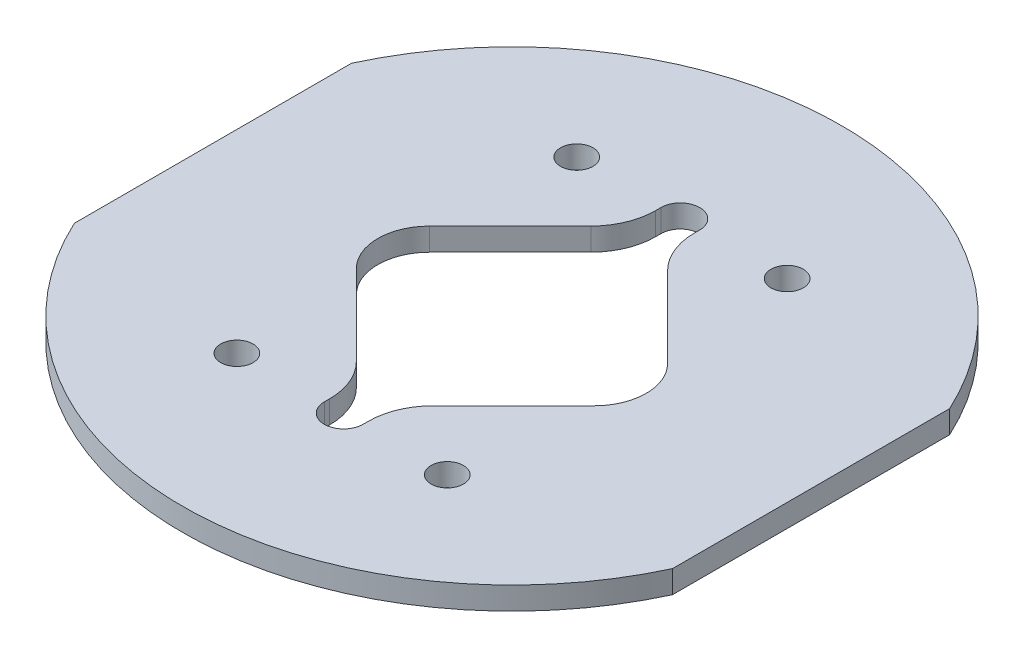
ISO-10303-21;
HEADER;
FILE_DESCRIPTION(('STEP AP214'),'2;1');
FILE_NAME('part.step','',(''),(''),'','','');
FILE_SCHEMA(('AUTOMOTIVE_DESIGN { 1 0 10303 214 1 1 1 1 }'));
ENDSEC;
DATA;
#1=APPLICATION_CONTEXT('core data for automotive mechanical design processes');
#2=APPLICATION_PROTOCOL_DEFINITION('international standard','automotive_design',2000,#1);
#3=PRODUCT_CONTEXT('',#1,'mechanical');
#4=PRODUCT('Part','Part','',(#3));
#5=PRODUCT_RELATED_PRODUCT_CATEGORY('part','',(#4));
#6=PRODUCT_DEFINITION_FORMATION('','',#4);
#7=PRODUCT_DEFINITION_CONTEXT('part definition',#1,'design');
#8=PRODUCT_DEFINITION('design','',#6,#7);
#9=PRODUCT_DEFINITION_SHAPE('','',#8);
#10=(LENGTH_UNIT() NAMED_UNIT(*) SI_UNIT(.MILLI.,.METRE.));
#11=(NAMED_UNIT(*) PLANE_ANGLE_UNIT() SI_UNIT($,.RADIAN.));
#12=(NAMED_UNIT(*) SI_UNIT($,.STERADIAN.) SOLID_ANGLE_UNIT());
#13=UNCERTAINTY_MEASURE_WITH_UNIT(LENGTH_MEASURE(1.E-05),#10,'distance_accuracy_value','');
#14=(GEOMETRIC_REPRESENTATION_CONTEXT(3) GLOBAL_UNCERTAINTY_ASSIGNED_CONTEXT((#13)) GLOBAL_UNIT_ASSIGNED_CONTEXT((#10,
#11,#12)) REPRESENTATION_CONTEXT('',''));
#15=CARTESIAN_POINT('',(0.,0.,0.));
#16=DIRECTION('',(0.,0.,1.));
#17=DIRECTION('',(1.,0.,0.));
#18=AXIS2_PLACEMENT_3D('',#15,#16,#17);
#19=CARTESIAN_POINT('',(0.,1.75,0.));
#20=DIRECTION('',(0.,-1.,0.));
#21=DIRECTION('',(0.,0.,-1.));
#22=AXIS2_PLACEMENT_3D('',#19,#20,#21);
#23=CYLINDRICAL_SURFACE('',#22,25.46);
#24=CARTESIAN_POINT('',(0.,0.,0.));
#25=DIRECTION('',(0.,1.,0.));
#26=DIRECTION('',(0.,0.,-1.));
#27=AXIS2_PLACEMENT_3D('',#24,#25,#26);
#28=CIRCLE('',#27,25.46);
#29=CARTESIAN_POINT('',(-23.1,0.,10.7052136830612));
#30=VERTEX_POINT('',#29);
#31=CARTESIAN_POINT('',(23.1,0.,10.7052136830612));
#32=VERTEX_POINT('',#31);
#33=EDGE_CURVE('E238',#30,#32,#28,.T.);
#34=ORIENTED_EDGE('',*,*,#33,.T.);
#35=DIRECTION('',(0.,-1.,0.));
#36=VECTOR('',#35,1.);
#37=CARTESIAN_POINT('',(23.1,1.75,10.7052136830612));
#38=LINE('',#37,#36);
#39=CARTESIAN_POINT('',(23.1,1.75,10.7052136830612));
#40=VERTEX_POINT('',#39);
#41=EDGE_CURVE('E272',#40,#32,#38,.T.);
#42=ORIENTED_EDGE('',*,*,#41,.F.);
#43=CARTESIAN_POINT('',(0.,1.75,0.));
#44=DIRECTION('',(0.,1.,0.));
#45=DIRECTION('',(0.,0.,-1.));
#46=AXIS2_PLACEMENT_3D('',#43,#44,#45);
#47=CIRCLE('',#46,25.46);
#48=CARTESIAN_POINT('',(-23.1,1.75,10.7052136830612));
#49=VERTEX_POINT('',#48);
#50=EDGE_CURVE('E246',#49,#40,#47,.T.);
#51=ORIENTED_EDGE('',*,*,#50,.F.);
#52=DIRECTION('',(0.,-1.,0.));
#53=VECTOR('',#52,1.);
#54=CARTESIAN_POINT('',(-23.1,1.75,10.7052136830612));
#55=LINE('',#54,#53);
#56=EDGE_CURVE('E256',#49,#30,#55,.T.);
#57=ORIENTED_EDGE('',*,*,#56,.T.);
#58=EDGE_LOOP('',(#34,#42,#51,#57));
#59=FACE_BOUND('',#58,.T.);
#60=ADVANCED_FACE('F34',(#59),#23,.T.);
#61=CARTESIAN_POINT('',(23.1,1.75,-10.7052136830612));
#62=DIRECTION('',(-1.,0.,0.));
#63=DIRECTION('',(0.,0.,1.));
#64=AXIS2_PLACEMENT_3D('',#61,#62,#63);
#65=PLANE('',#64);
#66=DIRECTION('',(0.,0.,-1.));
#67=VECTOR('',#66,1.);
#68=CARTESIAN_POINT('',(23.1,0.,-10.7052136830612));
#69=LINE('',#68,#67);
#70=CARTESIAN_POINT('',(23.1,0.,-10.7052136830612));
#71=VERTEX_POINT('',#70);
#72=EDGE_CURVE('E259',#32,#71,#69,.T.);
#73=ORIENTED_EDGE('',*,*,#72,.T.);
#74=DIRECTION('',(0.,-1.,0.));
#75=VECTOR('',#74,1.);
#76=CARTESIAN_POINT('',(23.1,1.75,-10.7052136830612));
#77=LINE('',#76,#75);
#78=CARTESIAN_POINT('',(23.1,1.75,-10.7052136830612));
#79=VERTEX_POINT('',#78);
#80=EDGE_CURVE('E269',#79,#71,#77,.T.);
#81=ORIENTED_EDGE('',*,*,#80,.F.);
#82=DIRECTION('',(0.,0.,-1.));
#83=VECTOR('',#82,1.);
#84=CARTESIAN_POINT('',(23.1,1.75,-10.7052136830612));
#85=LINE('',#84,#83);
#86=EDGE_CURVE('E249',#40,#79,#85,.T.);
#87=ORIENTED_EDGE('',*,*,#86,.F.);
#88=ORIENTED_EDGE('',*,*,#41,.T.);
#89=EDGE_LOOP('',(#73,#81,#87,#88));
#90=FACE_BOUND('',#89,.T.);
#91=ADVANCED_FACE('F393',(#90),#65,.F.);
#92=CARTESIAN_POINT('',(0.,1.75,0.));
#93=DIRECTION('',(0.,-1.,0.));
#94=DIRECTION('',(0.,0.,-1.));
#95=AXIS2_PLACEMENT_3D('',#92,#93,#94);
#96=CYLINDRICAL_SURFACE('',#95,25.46);
#97=CARTESIAN_POINT('',(0.,0.,0.));
#98=DIRECTION('',(0.,1.,0.));
#99=DIRECTION('',(0.,0.,-1.));
#100=AXIS2_PLACEMENT_3D('',#97,#98,#99);
#101=CIRCLE('',#100,25.46);
#102=CARTESIAN_POINT('',(-23.1,0.,-10.7052136830612));
#103=VERTEX_POINT('',#102);
#104=EDGE_CURVE('E261',#71,#103,#101,.T.);
#105=ORIENTED_EDGE('',*,*,#104,.T.);
#106=DIRECTION('',(0.,-1.,0.));
#107=VECTOR('',#106,1.);
#108=CARTESIAN_POINT('',(-23.1,1.75,-10.7052136830612));
#109=LINE('',#108,#107);
#110=CARTESIAN_POINT('',(-23.1,1.75,-10.7052136830612));
#111=VERTEX_POINT('',#110);
#112=EDGE_CURVE('E266',#111,#103,#109,.T.);
#113=ORIENTED_EDGE('',*,*,#112,.F.);
#114=CARTESIAN_POINT('',(0.,1.75,0.));
#115=DIRECTION('',(0.,1.,0.));
#116=DIRECTION('',(0.,0.,-1.));
#117=AXIS2_PLACEMENT_3D('',#114,#115,#116);
#118=CIRCLE('',#117,25.46);
#119=EDGE_CURVE('E252',#79,#111,#118,.T.);
#120=ORIENTED_EDGE('',*,*,#119,.F.);
#121=ORIENTED_EDGE('',*,*,#80,.T.);
#122=EDGE_LOOP('',(#105,#113,#120,#121));
#123=FACE_BOUND('',#122,.T.);
#124=ADVANCED_FACE('F399',(#123),#96,.T.);
#125=CARTESIAN_POINT('',(-23.1,1.75,10.7052136830612));
#126=DIRECTION('',(1.,0.,0.));
#127=DIRECTION('',(0.,0.,-1.));
#128=AXIS2_PLACEMENT_3D('',#125,#126,#127);
#129=PLANE('',#128);
#130=DIRECTION('',(0.,0.,1.));
#131=VECTOR('',#130,1.);
#132=CARTESIAN_POINT('',(-23.1,0.,10.7052136830612));
#133=LINE('',#132,#131);
#134=EDGE_CURVE('E250',#103,#30,#133,.T.);
#135=ORIENTED_EDGE('',*,*,#134,.T.);
#136=ORIENTED_EDGE('',*,*,#56,.F.);
#137=DIRECTION('',(0.,0.,1.));
#138=VECTOR('',#137,1.);
#139=CARTESIAN_POINT('',(-23.1,1.75,10.7052136830612));
#140=LINE('',#139,#138);
#141=EDGE_CURVE('E254',#111,#49,#140,.T.);
#142=ORIENTED_EDGE('',*,*,#141,.F.);
#143=ORIENTED_EDGE('',*,*,#112,.T.);
#144=EDGE_LOOP('',(#135,#136,#142,#143));
#145=FACE_BOUND('',#144,.T.);
#146=ADVANCED_FACE('F466',(#145),#129,.F.);
#147=CARTESIAN_POINT('',(0.,1.75,0.));
#148=DIRECTION('',(0.,-1.,0.));
#149=DIRECTION('',(0.,0.,-1.));
#150=AXIS2_PLACEMENT_3D('',#147,#148,#149);
#151=PLANE('',#150);
#152=CARTESIAN_POINT('',(8.125,1.75,13.125));
#153=DIRECTION('',(0.,1.,0.));
#154=DIRECTION('',(0.,0.,-1.));
#155=AXIS2_PLACEMENT_3D('',#152,#153,#154);
#156=CIRCLE('',#155,1.25);
#157=CARTESIAN_POINT('',(8.125,1.75,11.875));
#158=VERTEX_POINT('',#157);
#159=EDGE_CURVE('E444',#158,#158,#156,.T.);
#160=ORIENTED_EDGE('',*,*,#159,.F.);
#161=EDGE_LOOP('',(#160));
#162=FACE_BOUND('',#161,.T.);
#163=CARTESIAN_POINT('',(-8.125,1.75,13.125));
#164=DIRECTION('',(0.,1.,0.));
#165=DIRECTION('',(0.,0.,-1.));
#166=AXIS2_PLACEMENT_3D('',#163,#164,#165);
#167=CIRCLE('',#166,1.25);
#168=CARTESIAN_POINT('',(-8.125,1.75,11.875));
#169=VERTEX_POINT('',#168);
#170=EDGE_CURVE('E450',#169,#169,#167,.T.);
#171=ORIENTED_EDGE('',*,*,#170,.F.);
#172=EDGE_LOOP('',(#171));
#173=FACE_BOUND('',#172,.T.);
#174=CARTESIAN_POINT('',(-8.125,1.75,-13.125));
#175=DIRECTION('',(0.,1.,0.));
#176=DIRECTION('',(0.,0.,1.));
#177=AXIS2_PLACEMENT_3D('',#174,#175,#176);
#178=CIRCLE('',#177,1.25);
#179=CARTESIAN_POINT('',(-8.125,1.75,-11.875));
#180=VERTEX_POINT('',#179);
#181=EDGE_CURVE('E457',#180,#180,#178,.T.);
#182=ORIENTED_EDGE('',*,*,#181,.F.);
#183=EDGE_LOOP('',(#182));
#184=FACE_BOUND('',#183,.T.);
#185=CARTESIAN_POINT('',(8.125,1.75,-13.125));
#186=DIRECTION('',(0.,1.,0.));
#187=DIRECTION('',(0.,0.,1.));
#188=AXIS2_PLACEMENT_3D('',#185,#186,#187);
#189=CIRCLE('',#188,1.25);
#190=CARTESIAN_POINT('',(8.125,1.75,-11.875));
#191=VERTEX_POINT('',#190);
#192=EDGE_CURVE('E206',#191,#191,#189,.T.);
#193=ORIENTED_EDGE('',*,*,#192,.F.);
#194=EDGE_LOOP('',(#193));
#195=FACE_BOUND('',#194,.T.);
#196=DIRECTION('',(0.,0.,1.));
#197=VECTOR('',#196,1.);
#198=CARTESIAN_POINT('',(-1.5,1.75,-13.));
#199=LINE('',#198,#197);
#200=CARTESIAN_POINT('',(-1.49999999999998,1.75,12.5918830920368));
#201=VERTEX_POINT('',#200);
#202=CARTESIAN_POINT('',(-1.49999999999998,1.75,13.));
#203=VERTEX_POINT('',#202);
#204=EDGE_CURVE('E214',#201,#203,#199,.T.);
#205=ORIENTED_EDGE('',*,*,#204,.F.);
#206=CARTESIAN_POINT('',(-6.49999999999998,1.75,12.5918830920368));
#207=DIRECTION('',(0.,-1.,0.));
#208=DIRECTION('',(0.,0.,-1.));
#209=AXIS2_PLACEMENT_3D('',#206,#207,#208);
#210=CIRCLE('',#209,5.);
#211=CARTESIAN_POINT('',(-2.96446609406724,1.75,9.05634918610406));
#212=VERTEX_POINT('',#211);
#213=EDGE_CURVE('E295',#201,#212,#210,.F.);
#214=ORIENTED_EDGE('',*,*,#213,.T.);
#215=DIRECTION('',(0.707106781186548,0.,0.707106781186547));
#216=VECTOR('',#215,1.);
#217=CARTESIAN_POINT('',(0.,1.75,12.0208152801713));
#218=LINE('',#217,#216);
#219=CARTESIAN_POINT('',(-9.19238815542512,1.75,2.82842712474619));
#220=VERTEX_POINT('',#219);
#221=EDGE_CURVE('E232',#220,#212,#218,.T.);
#222=ORIENTED_EDGE('',*,*,#221,.F.);
#223=CARTESIAN_POINT('',(-6.36396103067893,1.75,0.));
#224=DIRECTION('',(0.,-1.,0.));
#225=DIRECTION('',(0.,0.,-1.));
#226=AXIS2_PLACEMENT_3D('',#223,#224,#225);
#227=CIRCLE('',#226,4.);
#228=CARTESIAN_POINT('',(-9.19238815542512,1.75,-2.82842712474619));
#229=VERTEX_POINT('',#228);
#230=EDGE_CURVE('E42',#220,#229,#227,.T.);
#231=ORIENTED_EDGE('',*,*,#230,.T.);
#232=DIRECTION('',(-0.707106781186548,0.,0.707106781186548));
#233=VECTOR('',#232,1.);
#234=CARTESIAN_POINT('',(-12.0208152801713,1.75,0.));
#235=LINE('',#234,#233);
#236=CARTESIAN_POINT('',(-2.96446609406725,1.75,-9.05634918610406));
#237=VERTEX_POINT('',#236);
#238=EDGE_CURVE('E243',#237,#229,#235,.T.);
#239=ORIENTED_EDGE('',*,*,#238,.F.);
#240=CARTESIAN_POINT('',(-6.5,1.75,-12.5918830920368));
#241=DIRECTION('',(0.,-1.,0.));
#242=DIRECTION('',(0.,0.,-1.));
#243=AXIS2_PLACEMENT_3D('',#240,#241,#242);
#244=CIRCLE('',#243,5.);
#245=CARTESIAN_POINT('',(-1.5,1.75,-12.5918830920368));
#246=VERTEX_POINT('',#245);
#247=EDGE_CURVE('E288',#237,#246,#244,.F.);
#248=ORIENTED_EDGE('',*,*,#247,.T.);
#249=CARTESIAN_POINT('',(-1.5,1.75,-13.));
#250=VERTEX_POINT('',#249);
#251=EDGE_CURVE('E216',#250,#246,#199,.T.);
#252=ORIENTED_EDGE('',*,*,#251,.F.);
#253=CARTESIAN_POINT('',(0.,1.75,-13.));
#254=DIRECTION('',(0.,1.,0.));
#255=DIRECTION('',(0.,0.,1.));
#256=AXIS2_PLACEMENT_3D('',#253,#254,#255);
#257=CIRCLE('',#256,1.5);
#258=CARTESIAN_POINT('',(1.5,1.75,-13.));
#259=VERTEX_POINT('',#258);
#260=EDGE_CURVE('E178',#259,#250,#257,.T.);
#261=ORIENTED_EDGE('',*,*,#260,.F.);
#262=DIRECTION('',(0.,0.,-1.));
#263=VECTOR('',#262,1.);
#264=CARTESIAN_POINT('',(1.5,1.75,13.));
#265=LINE('',#264,#263);
#266=CARTESIAN_POINT('',(1.5,1.75,-12.5918830920368));
#267=VERTEX_POINT('',#266);
#268=EDGE_CURVE('E203',#267,#259,#265,.T.);
#269=ORIENTED_EDGE('',*,*,#268,.F.);
#270=CARTESIAN_POINT('',(6.5,1.75,-12.5918830920368));
#271=DIRECTION('',(0.,-1.,0.));
#272=DIRECTION('',(0.,0.,-1.));
#273=AXIS2_PLACEMENT_3D('',#270,#271,#272);
#274=CIRCLE('',#273,5.);
#275=CARTESIAN_POINT('',(2.96446609406726,1.75,-9.05634918610405));
#276=VERTEX_POINT('',#275);
#277=EDGE_CURVE('E290',#267,#276,#274,.F.);
#278=ORIENTED_EDGE('',*,*,#277,.T.);
#279=DIRECTION('',(-0.707106781186548,0.,-0.707106781186548));
#280=VECTOR('',#279,1.);
#281=CARTESIAN_POINT('',(12.0208152801713,1.75,0.));
#282=LINE('',#281,#280);
#283=CARTESIAN_POINT('',(9.19238815542512,1.75,-2.82842712474619));
#284=VERTEX_POINT('',#283);
#285=EDGE_CURVE('E241',#284,#276,#282,.T.);
#286=ORIENTED_EDGE('',*,*,#285,.F.);
#287=CARTESIAN_POINT('',(6.36396103067893,1.75,0.));
#288=DIRECTION('',(0.,-1.,0.));
#289=DIRECTION('',(0.,0.,-1.));
#290=AXIS2_PLACEMENT_3D('',#287,#288,#289);
#291=CIRCLE('',#290,4.);
#292=CARTESIAN_POINT('',(9.19238815542512,1.75,2.82842712474619));
#293=VERTEX_POINT('',#292);
#294=EDGE_CURVE('E321',#284,#293,#291,.T.);
#295=ORIENTED_EDGE('',*,*,#294,.T.);
#296=DIRECTION('',(0.707106781186548,0.,-0.707106781186547));
#297=VECTOR('',#296,1.);
#298=CARTESIAN_POINT('',(0.,1.75,12.0208152801713));
#299=LINE('',#298,#297);
#300=CARTESIAN_POINT('',(2.96446609406726,1.75,9.05634918610405));
#301=VERTEX_POINT('',#300);
#302=EDGE_CURVE('E223',#301,#293,#299,.T.);
#303=ORIENTED_EDGE('',*,*,#302,.F.);
#304=CARTESIAN_POINT('',(6.5,1.75,12.5918830920368));
#305=DIRECTION('',(0.,-1.,0.));
#306=DIRECTION('',(0.,0.,-1.));
#307=AXIS2_PLACEMENT_3D('',#304,#305,#306);
#308=CIRCLE('',#307,5.);
#309=CARTESIAN_POINT('',(1.5,1.75,12.5918830920368));
#310=VERTEX_POINT('',#309);
#311=EDGE_CURVE('E293',#301,#310,#308,.F.);
#312=ORIENTED_EDGE('',*,*,#311,.T.);
#313=CARTESIAN_POINT('',(1.5,1.75,13.));
#314=VERTEX_POINT('',#313);
#315=EDGE_CURVE('E200',#314,#310,#265,.T.);
#316=ORIENTED_EDGE('',*,*,#315,.F.);
#317=CARTESIAN_POINT('',(0.,1.75,13.));
#318=DIRECTION('',(0.,1.,0.));
#319=DIRECTION('',(0.,0.,-1.));
#320=AXIS2_PLACEMENT_3D('',#317,#318,#319);
#321=CIRCLE('',#320,1.49999999999999);
#322=EDGE_CURVE('E218',#203,#314,#321,.T.);
#323=ORIENTED_EDGE('',*,*,#322,.F.);
#324=EDGE_LOOP('',(#205,#214,#222,#231,#239,#248,#252,#261,#269,#278,#286,#295,#303,#312,#316,#323));
#325=FACE_BOUND('',#324,.T.);
#326=ORIENTED_EDGE('',*,*,#50,.T.);
#327=ORIENTED_EDGE('',*,*,#86,.T.);
#328=ORIENTED_EDGE('',*,*,#119,.T.);
#329=ORIENTED_EDGE('',*,*,#141,.T.);
#330=EDGE_LOOP('',(#326,#327,#328,#329));
#331=FACE_BOUND('',#330,.T.);
#332=ADVANCED_FACE('F338',(#162,#173,#184,#195,#325,#331),#151,.F.);
#333=CARTESIAN_POINT('',(0.,0.,0.));
#334=DIRECTION('',(0.,-1.,0.));
#335=DIRECTION('',(0.,0.,-1.));
#336=AXIS2_PLACEMENT_3D('',#333,#334,#335);
#337=PLANE('',#336);
#338=CARTESIAN_POINT('',(8.125,0.,13.125));
#339=DIRECTION('',(0.,1.,0.));
#340=DIRECTION('',(0.,0.,-1.));
#341=AXIS2_PLACEMENT_3D('',#338,#339,#340);
#342=CIRCLE('',#341,1.25);
#343=CARTESIAN_POINT('',(8.125,0.,11.875));
#344=VERTEX_POINT('',#343);
#345=EDGE_CURVE('E441',#344,#344,#342,.T.);
#346=ORIENTED_EDGE('',*,*,#345,.T.);
#347=EDGE_LOOP('',(#346));
#348=FACE_BOUND('',#347,.T.);
#349=CARTESIAN_POINT('',(-8.125,0.,13.125));
#350=DIRECTION('',(0.,1.,0.));
#351=DIRECTION('',(0.,0.,-1.));
#352=AXIS2_PLACEMENT_3D('',#349,#350,#351);
#353=CIRCLE('',#352,1.25);
#354=CARTESIAN_POINT('',(-8.125,0.,11.875));
#355=VERTEX_POINT('',#354);
#356=EDGE_CURVE('E446',#355,#355,#353,.T.);
#357=ORIENTED_EDGE('',*,*,#356,.T.);
#358=EDGE_LOOP('',(#357));
#359=FACE_BOUND('',#358,.T.);
#360=CARTESIAN_POINT('',(-8.125,0.,-13.125));
#361=DIRECTION('',(0.,1.,0.));
#362=DIRECTION('',(0.,0.,1.));
#363=AXIS2_PLACEMENT_3D('',#360,#361,#362);
#364=CIRCLE('',#363,1.25);
#365=CARTESIAN_POINT('',(-8.125,0.,-11.875));
#366=VERTEX_POINT('',#365);
#367=EDGE_CURVE('E215',#366,#366,#364,.T.);
#368=ORIENTED_EDGE('',*,*,#367,.T.);
#369=EDGE_LOOP('',(#368));
#370=FACE_BOUND('',#369,.T.);
#371=CARTESIAN_POINT('',(8.125,0.,-13.125));
#372=DIRECTION('',(0.,1.,0.));
#373=DIRECTION('',(0.,0.,1.));
#374=AXIS2_PLACEMENT_3D('',#371,#372,#373);
#375=CIRCLE('',#374,1.25);
#376=CARTESIAN_POINT('',(8.125,0.,-11.875));
#377=VERTEX_POINT('',#376);
#378=EDGE_CURVE('E459',#377,#377,#375,.T.);
#379=ORIENTED_EDGE('',*,*,#378,.T.);
#380=EDGE_LOOP('',(#379));
#381=FACE_BOUND('',#380,.T.);
#382=DIRECTION('',(-0.707106781186548,0.,0.707106781186548));
#383=VECTOR('',#382,1.);
#384=CARTESIAN_POINT('',(-12.0208152801713,0.,0.));
#385=LINE('',#384,#383);
#386=CARTESIAN_POINT('',(-2.96446609406725,0.,-9.05634918610406));
#387=VERTEX_POINT('',#386);
#388=CARTESIAN_POINT('',(-9.19238815542512,0.,-2.82842712474619));
#389=VERTEX_POINT('',#388);
#390=EDGE_CURVE('E234',#387,#389,#385,.T.);
#391=ORIENTED_EDGE('',*,*,#390,.T.);
#392=CARTESIAN_POINT('',(-6.36396103067893,0.,0.));
#393=DIRECTION('',(0.,-1.,0.));
#394=DIRECTION('',(0.,0.,-1.));
#395=AXIS2_PLACEMENT_3D('',#392,#393,#394);
#396=CIRCLE('',#395,4.);
#397=CARTESIAN_POINT('',(-9.19238815542512,0.,2.82842712474619));
#398=VERTEX_POINT('',#397);
#399=EDGE_CURVE('E11',#389,#398,#396,.F.);
#400=ORIENTED_EDGE('',*,*,#399,.T.);
#401=DIRECTION('',(0.707106781186548,0.,0.707106781186547));
#402=VECTOR('',#401,1.);
#403=CARTESIAN_POINT('',(0.,0.,12.0208152801713));
#404=LINE('',#403,#402);
#405=CARTESIAN_POINT('',(-2.96446609406724,0.,9.05634918610406));
#406=VERTEX_POINT('',#405);
#407=EDGE_CURVE('E236',#398,#406,#404,.T.);
#408=ORIENTED_EDGE('',*,*,#407,.T.);
#409=CARTESIAN_POINT('',(-6.49999999999998,0.,12.5918830920368));
#410=DIRECTION('',(0.,-1.,0.));
#411=DIRECTION('',(0.,0.,-1.));
#412=AXIS2_PLACEMENT_3D('',#409,#410,#411);
#413=CIRCLE('',#412,5.);
#414=CARTESIAN_POINT('',(-1.49999999999998,0.,12.5918830920368));
#415=VERTEX_POINT('',#414);
#416=EDGE_CURVE('E284',#406,#415,#413,.T.);
#417=ORIENTED_EDGE('',*,*,#416,.T.);
#418=DIRECTION('',(0.,0.,1.));
#419=VECTOR('',#418,1.);
#420=CARTESIAN_POINT('',(-1.5,0.,-13.));
#421=LINE('',#420,#419);
#422=CARTESIAN_POINT('',(-1.49999999999998,0.,13.));
#423=VERTEX_POINT('',#422);
#424=EDGE_CURVE('E193',#415,#423,#421,.T.);
#425=ORIENTED_EDGE('',*,*,#424,.T.);
#426=CARTESIAN_POINT('',(0.,0.,13.));
#427=DIRECTION('',(0.,1.,0.));
#428=DIRECTION('',(0.,0.,-1.));
#429=AXIS2_PLACEMENT_3D('',#426,#427,#428);
#430=CIRCLE('',#429,1.49999999999999);
#431=CARTESIAN_POINT('',(1.5,0.,13.));
#432=VERTEX_POINT('',#431);
#433=EDGE_CURVE('E192',#423,#432,#430,.T.);
#434=ORIENTED_EDGE('',*,*,#433,.T.);
#435=DIRECTION('',(0.,0.,-1.));
#436=VECTOR('',#435,1.);
#437=CARTESIAN_POINT('',(1.5,0.,13.));
#438=LINE('',#437,#436);
#439=CARTESIAN_POINT('',(1.5,0.,12.5918830920368));
#440=VERTEX_POINT('',#439);
#441=EDGE_CURVE('E183',#432,#440,#438,.T.);
#442=ORIENTED_EDGE('',*,*,#441,.T.);
#443=CARTESIAN_POINT('',(6.5,0.,12.5918830920368));
#444=DIRECTION('',(0.,-1.,0.));
#445=DIRECTION('',(0.,0.,-1.));
#446=AXIS2_PLACEMENT_3D('',#443,#444,#445);
#447=CIRCLE('',#446,5.);
#448=CARTESIAN_POINT('',(2.96446609406726,0.,9.05634918610405));
#449=VERTEX_POINT('',#448);
#450=EDGE_CURVE('E282',#440,#449,#447,.T.);
#451=ORIENTED_EDGE('',*,*,#450,.T.);
#452=DIRECTION('',(0.707106781186548,0.,-0.707106781186547));
#453=VECTOR('',#452,1.);
#454=CARTESIAN_POINT('',(0.,0.,12.0208152801713));
#455=LINE('',#454,#453);
#456=CARTESIAN_POINT('',(9.19238815542512,0.,2.82842712474619));
#457=VERTEX_POINT('',#456);
#458=EDGE_CURVE('E228',#449,#457,#455,.T.);
#459=ORIENTED_EDGE('',*,*,#458,.T.);
#460=CARTESIAN_POINT('',(6.36396103067893,0.,0.));
#461=DIRECTION('',(0.,-1.,0.));
#462=DIRECTION('',(0.,0.,-1.));
#463=AXIS2_PLACEMENT_3D('',#460,#461,#462);
#464=CIRCLE('',#463,4.);
#465=CARTESIAN_POINT('',(9.19238815542512,0.,-2.82842712474619));
#466=VERTEX_POINT('',#465);
#467=EDGE_CURVE('E323',#457,#466,#464,.F.);
#468=ORIENTED_EDGE('',*,*,#467,.T.);
#469=DIRECTION('',(-0.707106781186548,0.,-0.707106781186548));
#470=VECTOR('',#469,1.);
#471=CARTESIAN_POINT('',(12.0208152801713,0.,0.));
#472=LINE('',#471,#470);
#473=CARTESIAN_POINT('',(2.96446609406726,0.,-9.05634918610405));
#474=VERTEX_POINT('',#473);
#475=EDGE_CURVE('E231',#466,#474,#472,.T.);
#476=ORIENTED_EDGE('',*,*,#475,.T.);
#477=CARTESIAN_POINT('',(6.5,0.,-12.5918830920368));
#478=DIRECTION('',(0.,-1.,0.));
#479=DIRECTION('',(0.,0.,-1.));
#480=AXIS2_PLACEMENT_3D('',#477,#478,#479);
#481=CIRCLE('',#480,5.);
#482=CARTESIAN_POINT('',(1.5,0.,-12.5918830920368));
#483=VERTEX_POINT('',#482);
#484=EDGE_CURVE('E280',#474,#483,#481,.T.);
#485=ORIENTED_EDGE('',*,*,#484,.T.);
#486=CARTESIAN_POINT('',(1.5,0.,-13.));
#487=VERTEX_POINT('',#486);
#488=EDGE_CURVE('E198',#483,#487,#438,.T.);
#489=ORIENTED_EDGE('',*,*,#488,.T.);
#490=CARTESIAN_POINT('',(0.,0.,-13.));
#491=DIRECTION('',(0.,1.,0.));
#492=DIRECTION('',(0.,0.,1.));
#493=AXIS2_PLACEMENT_3D('',#490,#491,#492);
#494=CIRCLE('',#493,1.5);
#495=CARTESIAN_POINT('',(-1.5,0.,-13.));
#496=VERTEX_POINT('',#495);
#497=EDGE_CURVE('E176',#487,#496,#494,.T.);
#498=ORIENTED_EDGE('',*,*,#497,.T.);
#499=CARTESIAN_POINT('',(-1.5,0.,-12.5918830920368));
#500=VERTEX_POINT('',#499);
#501=EDGE_CURVE('E186',#496,#500,#421,.T.);
#502=ORIENTED_EDGE('',*,*,#501,.T.);
#503=CARTESIAN_POINT('',(-6.5,0.,-12.5918830920368));
#504=DIRECTION('',(0.,-1.,0.));
#505=DIRECTION('',(0.,0.,-1.));
#506=AXIS2_PLACEMENT_3D('',#503,#504,#505);
#507=CIRCLE('',#506,5.);
#508=EDGE_CURVE('E278',#500,#387,#507,.T.);
#509=ORIENTED_EDGE('',*,*,#508,.T.);
#510=EDGE_LOOP('',(#391,#400,#408,#417,#425,#434,#442,#451,#459,#468,#476,#485,#489,#498,#502,#509));
#511=FACE_BOUND('',#510,.T.);
#512=ORIENTED_EDGE('',*,*,#33,.F.);
#513=ORIENTED_EDGE('',*,*,#134,.F.);
#514=ORIENTED_EDGE('',*,*,#104,.F.);
#515=ORIENTED_EDGE('',*,*,#72,.F.);
#516=EDGE_LOOP('',(#512,#513,#514,#515));
#517=FACE_BOUND('',#516,.T.);
#518=ADVANCED_FACE('F195',(#348,#359,#370,#381,#511,#517),#337,.T.);
#519=CARTESIAN_POINT('',(0.,0.,12.0208152801713));
#520=DIRECTION('',(0.707106781186547,0.,0.707106781186548));
#521=DIRECTION('',(0.707106781186548,0.,-0.707106781186547));
#522=AXIS2_PLACEMENT_3D('',#519,#520,#521);
#523=PLANE('',#522);
#524=ORIENTED_EDGE('',*,*,#302,.T.);
#525=DIRECTION('',(0.,1.,0.));
#526=VECTOR('',#525,1.);
#527=CARTESIAN_POINT('',(9.19238815542512,0.,2.82842712474619));
#528=LINE('',#527,#526);
#529=EDGE_CURVE('E315',#293,#457,#528,.F.);
#530=ORIENTED_EDGE('',*,*,#529,.T.);
#531=ORIENTED_EDGE('',*,*,#458,.F.);
#532=DIRECTION('',(0.,1.,0.));
#533=VECTOR('',#532,1.);
#534=CARTESIAN_POINT('',(2.96446609406726,0.,9.05634918610405));
#535=LINE('',#534,#533);
#536=EDGE_CURVE('E298',#449,#301,#535,.T.);
#537=ORIENTED_EDGE('',*,*,#536,.T.);
#538=EDGE_LOOP('',(#524,#530,#531,#537));
#539=FACE_BOUND('',#538,.T.);
#540=ADVANCED_FACE('F341',(#539),#523,.F.);
#541=CARTESIAN_POINT('',(0.,0.,12.0208152801713));
#542=DIRECTION('',(-0.707106781186547,0.,0.707106781186548));
#543=DIRECTION('',(0.707106781186548,0.,0.707106781186547));
#544=AXIS2_PLACEMENT_3D('',#541,#542,#543);
#545=PLANE('',#544);
#546=ORIENTED_EDGE('',*,*,#407,.F.);
#547=DIRECTION('',(0.,1.,0.));
#548=VECTOR('',#547,1.);
#549=CARTESIAN_POINT('',(-9.19238815542512,1.75,2.82842712474619));
#550=LINE('',#549,#548);
#551=EDGE_CURVE('E317',#398,#220,#550,.T.);
#552=ORIENTED_EDGE('',*,*,#551,.T.);
#553=ORIENTED_EDGE('',*,*,#221,.T.);
#554=DIRECTION('',(0.,-1.,0.));
#555=VECTOR('',#554,1.);
#556=CARTESIAN_POINT('',(-2.96446609406724,0.,9.05634918610406));
#557=LINE('',#556,#555);
#558=EDGE_CURVE('E275',#212,#406,#557,.T.);
#559=ORIENTED_EDGE('',*,*,#558,.T.);
#560=EDGE_LOOP('',(#546,#552,#553,#559));
#561=FACE_BOUND('',#560,.T.);
#562=ADVANCED_FACE('F365',(#561),#545,.F.);
#563=CARTESIAN_POINT('',(-12.0208152801713,0.,0.));
#564=DIRECTION('',(-0.707106781186548,0.,-0.707106781186547));
#565=DIRECTION('',(-0.707106781186547,0.,0.707106781186548));
#566=AXIS2_PLACEMENT_3D('',#563,#564,#565);
#567=PLANE('',#566);
#568=ORIENTED_EDGE('',*,*,#238,.T.);
#569=DIRECTION('',(0.,1.,0.));
#570=VECTOR('',#569,1.);
#571=CARTESIAN_POINT('',(-9.19238815542512,0.,-2.82842712474619));
#572=LINE('',#571,#570);
#573=EDGE_CURVE('E55',#229,#389,#572,.F.);
#574=ORIENTED_EDGE('',*,*,#573,.T.);
#575=ORIENTED_EDGE('',*,*,#390,.F.);
#576=DIRECTION('',(0.,1.,0.));
#577=VECTOR('',#576,1.);
#578=CARTESIAN_POINT('',(-2.96446609406726,0.,-9.05634918610405));
#579=LINE('',#578,#577);
#580=EDGE_CURVE('E308',#387,#237,#579,.T.);
#581=ORIENTED_EDGE('',*,*,#580,.T.);
#582=EDGE_LOOP('',(#568,#574,#575,#581));
#583=FACE_BOUND('',#582,.T.);
#584=ADVANCED_FACE('F370',(#583),#567,.F.);
#585=CARTESIAN_POINT('',(12.0208152801713,0.,0.));
#586=DIRECTION('',(0.707106781186548,0.,-0.707106781186547));
#587=DIRECTION('',(-0.707106781186547,0.,-0.707106781186548));
#588=AXIS2_PLACEMENT_3D('',#585,#586,#587);
#589=PLANE('',#588);
#590=ORIENTED_EDGE('',*,*,#475,.F.);
#591=DIRECTION('',(0.,1.,0.));
#592=VECTOR('',#591,1.);
#593=CARTESIAN_POINT('',(9.19238815542512,1.75,-2.82842712474619));
#594=LINE('',#593,#592);
#595=EDGE_CURVE('E312',#466,#284,#594,.T.);
#596=ORIENTED_EDGE('',*,*,#595,.T.);
#597=ORIENTED_EDGE('',*,*,#285,.T.);
#598=DIRECTION('',(0.,-1.,0.));
#599=VECTOR('',#598,1.);
#600=CARTESIAN_POINT('',(2.96446609406726,0.,-9.05634918610405));
#601=LINE('',#600,#599);
#602=EDGE_CURVE('E303',#276,#474,#601,.T.);
#603=ORIENTED_EDGE('',*,*,#602,.T.);
#604=EDGE_LOOP('',(#590,#596,#597,#603));
#605=FACE_BOUND('',#604,.T.);
#606=ADVANCED_FACE('F332',(#605),#589,.F.);
#607=CARTESIAN_POINT('',(-1.5,0.,-13.));
#608=DIRECTION('',(-1.,0.,0.));
#609=DIRECTION('',(0.,0.,1.));
#610=AXIS2_PLACEMENT_3D('',#607,#608,#609);
#611=PLANE('',#610);
#612=ORIENTED_EDGE('',*,*,#251,.T.);
#613=DIRECTION('',(0.,1.,0.));
#614=VECTOR('',#613,1.);
#615=CARTESIAN_POINT('',(-1.5,0.,-12.5918830920368));
#616=LINE('',#615,#614);
#617=EDGE_CURVE('E189',#246,#500,#616,.F.);
#618=ORIENTED_EDGE('',*,*,#617,.T.);
#619=ORIENTED_EDGE('',*,*,#501,.F.);
#620=DIRECTION('',(0.,1.,0.));
#621=VECTOR('',#620,1.);
#622=CARTESIAN_POINT('',(-1.5,0.,-13.));
#623=LINE('',#622,#621);
#624=EDGE_CURVE('E171',#496,#250,#623,.T.);
#625=ORIENTED_EDGE('',*,*,#624,.T.);
#626=EDGE_LOOP('',(#612,#618,#619,#625));
#627=FACE_BOUND('',#626,.T.);
#628=ADVANCED_FACE('F187',(#627),#611,.F.);
#629=CARTESIAN_POINT('',(1.5,0.,13.));
#630=DIRECTION('',(1.,0.,0.));
#631=DIRECTION('',(0.,0.,-1.));
#632=AXIS2_PLACEMENT_3D('',#629,#630,#631);
#633=PLANE('',#632);
#634=ORIENTED_EDGE('',*,*,#488,.F.);
#635=DIRECTION('',(0.,-1.,0.));
#636=VECTOR('',#635,1.);
#637=CARTESIAN_POINT('',(1.5,0.,-12.5918830920368));
#638=LINE('',#637,#636);
#639=EDGE_CURVE('E306',#483,#267,#638,.F.);
#640=ORIENTED_EDGE('',*,*,#639,.T.);
#641=ORIENTED_EDGE('',*,*,#268,.T.);
#642=DIRECTION('',(0.,1.,0.));
#643=VECTOR('',#642,1.);
#644=CARTESIAN_POINT('',(1.5,0.,-13.));
#645=LINE('',#644,#643);
#646=EDGE_CURVE('E221',#487,#259,#645,.T.);
#647=ORIENTED_EDGE('',*,*,#646,.F.);
#648=EDGE_LOOP('',(#634,#640,#641,#647));
#649=FACE_BOUND('',#648,.T.);
#650=ADVANCED_FACE('F379',(#649),#633,.F.);
#651=CARTESIAN_POINT('',(0.,0.,-13.));
#652=DIRECTION('',(0.,1.,0.));
#653=DIRECTION('',(0.,0.,1.));
#654=AXIS2_PLACEMENT_3D('',#651,#652,#653);
#655=CYLINDRICAL_SURFACE('',#654,1.5);
#656=ORIENTED_EDGE('',*,*,#260,.T.);
#657=ORIENTED_EDGE('',*,*,#624,.F.);
#658=ORIENTED_EDGE('',*,*,#497,.F.);
#659=ORIENTED_EDGE('',*,*,#646,.T.);
#660=EDGE_LOOP('',(#656,#657,#658,#659));
#661=FACE_BOUND('',#660,.T.);
#662=ADVANCED_FACE('F173',(#661),#655,.F.);
#663=ORIENTED_EDGE('',*,*,#424,.F.);
#664=DIRECTION('',(0.,-1.,0.));
#665=VECTOR('',#664,1.);
#666=CARTESIAN_POINT('',(-1.49999999999998,0.,12.5918830920368));
#667=LINE('',#666,#665);
#668=EDGE_CURVE('E286',#415,#201,#667,.F.);
#669=ORIENTED_EDGE('',*,*,#668,.T.);
#670=ORIENTED_EDGE('',*,*,#204,.T.);
#671=DIRECTION('',(0.,1.,0.));
#672=VECTOR('',#671,1.);
#673=CARTESIAN_POINT('',(-1.49999999999998,0.,13.));
#674=LINE('',#673,#672);
#675=EDGE_CURVE('E182',#423,#203,#674,.T.);
#676=ORIENTED_EDGE('',*,*,#675,.F.);
#677=EDGE_LOOP('',(#663,#669,#670,#676));
#678=FACE_BOUND('',#677,.T.);
#679=ADVANCED_FACE('F386',(#678),#611,.F.);
#680=ORIENTED_EDGE('',*,*,#315,.T.);
#681=DIRECTION('',(0.,1.,0.));
#682=VECTOR('',#681,1.);
#683=CARTESIAN_POINT('',(1.5,0.,12.5918830920368));
#684=LINE('',#683,#682);
#685=EDGE_CURVE('E301',#310,#440,#684,.F.);
#686=ORIENTED_EDGE('',*,*,#685,.T.);
#687=ORIENTED_EDGE('',*,*,#441,.F.);
#688=DIRECTION('',(0.,1.,0.));
#689=VECTOR('',#688,1.);
#690=CARTESIAN_POINT('',(1.5,0.,13.));
#691=LINE('',#690,#689);
#692=EDGE_CURVE('E224',#432,#314,#691,.T.);
#693=ORIENTED_EDGE('',*,*,#692,.T.);
#694=EDGE_LOOP('',(#680,#686,#687,#693));
#695=FACE_BOUND('',#694,.T.);
#696=ADVANCED_FACE('F350',(#695),#633,.F.);
#697=CARTESIAN_POINT('',(0.,0.,13.));
#698=DIRECTION('',(0.,1.,0.));
#699=DIRECTION('',(0.,0.,1.));
#700=AXIS2_PLACEMENT_3D('',#697,#698,#699);
#701=CYLINDRICAL_SURFACE('',#700,1.49999999999999);
#702=ORIENTED_EDGE('',*,*,#322,.T.);
#703=ORIENTED_EDGE('',*,*,#692,.F.);
#704=ORIENTED_EDGE('',*,*,#433,.F.);
#705=ORIENTED_EDGE('',*,*,#675,.T.);
#706=EDGE_LOOP('',(#702,#703,#704,#705));
#707=FACE_BOUND('',#706,.T.);
#708=ADVANCED_FACE('F354',(#707),#701,.F.);
#709=CARTESIAN_POINT('',(-6.49999999999998,0.,12.5918830920368));
#710=DIRECTION('',(0.,-1.,0.));
#711=DIRECTION('',(0.,0.,-1.));
#712=AXIS2_PLACEMENT_3D('',#709,#710,#711);
#713=CYLINDRICAL_SURFACE('',#712,5.);
#714=ORIENTED_EDGE('',*,*,#213,.F.);
#715=ORIENTED_EDGE('',*,*,#668,.F.);
#716=ORIENTED_EDGE('',*,*,#416,.F.);
#717=ORIENTED_EDGE('',*,*,#558,.F.);
#718=EDGE_LOOP('',(#714,#715,#716,#717));
#719=FACE_BOUND('',#718,.T.);
#720=ADVANCED_FACE('F361',(#719),#713,.T.);
#721=CARTESIAN_POINT('',(6.5,0.,12.5918830920368));
#722=DIRECTION('',(0.,1.,0.));
#723=DIRECTION('',(0.,0.,1.));
#724=AXIS2_PLACEMENT_3D('',#721,#722,#723);
#725=CYLINDRICAL_SURFACE('',#724,5.);
#726=ORIENTED_EDGE('',*,*,#450,.F.);
#727=ORIENTED_EDGE('',*,*,#685,.F.);
#728=ORIENTED_EDGE('',*,*,#311,.F.);
#729=ORIENTED_EDGE('',*,*,#536,.F.);
#730=EDGE_LOOP('',(#726,#727,#728,#729));
#731=FACE_BOUND('',#730,.T.);
#732=ADVANCED_FACE('F345',(#731),#725,.T.);
#733=CARTESIAN_POINT('',(6.5,0.,-12.5918830920368));
#734=DIRECTION('',(0.,-1.,0.));
#735=DIRECTION('',(0.,0.,-1.));
#736=AXIS2_PLACEMENT_3D('',#733,#734,#735);
#737=CYLINDRICAL_SURFACE('',#736,5.);
#738=ORIENTED_EDGE('',*,*,#277,.F.);
#739=ORIENTED_EDGE('',*,*,#639,.F.);
#740=ORIENTED_EDGE('',*,*,#484,.F.);
#741=ORIENTED_EDGE('',*,*,#602,.F.);
#742=EDGE_LOOP('',(#738,#739,#740,#741));
#743=FACE_BOUND('',#742,.T.);
#744=ADVANCED_FACE('F378',(#743),#737,.T.);
#745=CARTESIAN_POINT('',(-6.5,0.,-12.5918830920368));
#746=DIRECTION('',(0.,1.,0.));
#747=DIRECTION('',(0.,0.,1.));
#748=AXIS2_PLACEMENT_3D('',#745,#746,#747);
#749=CYLINDRICAL_SURFACE('',#748,5.);
#750=ORIENTED_EDGE('',*,*,#508,.F.);
#751=ORIENTED_EDGE('',*,*,#617,.F.);
#752=ORIENTED_EDGE('',*,*,#247,.F.);
#753=ORIENTED_EDGE('',*,*,#580,.F.);
#754=EDGE_LOOP('',(#750,#751,#752,#753));
#755=FACE_BOUND('',#754,.T.);
#756=ADVANCED_FACE('F372',(#755),#749,.T.);
#757=CARTESIAN_POINT('',(6.36396103067893,0.,0.));
#758=DIRECTION('',(0.,-1.,0.));
#759=DIRECTION('',(0.,0.,-1.));
#760=AXIS2_PLACEMENT_3D('',#757,#758,#759);
#761=CYLINDRICAL_SURFACE('',#760,4.);
#762=ORIENTED_EDGE('',*,*,#467,.F.);
#763=ORIENTED_EDGE('',*,*,#529,.F.);
#764=ORIENTED_EDGE('',*,*,#294,.F.);
#765=ORIENTED_EDGE('',*,*,#595,.F.);
#766=EDGE_LOOP('',(#762,#763,#764,#765));
#767=FACE_BOUND('',#766,.T.);
#768=ADVANCED_FACE('F335',(#767),#761,.F.);
#769=CARTESIAN_POINT('',(-6.36396103067893,0.,0.));
#770=DIRECTION('',(0.,-1.,0.));
#771=DIRECTION('',(0.,0.,-1.));
#772=AXIS2_PLACEMENT_3D('',#769,#770,#771);
#773=CYLINDRICAL_SURFACE('',#772,4.);
#774=ORIENTED_EDGE('',*,*,#399,.F.);
#775=ORIENTED_EDGE('',*,*,#573,.F.);
#776=ORIENTED_EDGE('',*,*,#230,.F.);
#777=ORIENTED_EDGE('',*,*,#551,.F.);
#778=EDGE_LOOP('',(#774,#775,#776,#777));
#779=FACE_BOUND('',#778,.T.);
#780=ADVANCED_FACE('F36',(#779),#773,.F.);
#781=CARTESIAN_POINT('',(8.125,0.,-13.125));
#782=DIRECTION('',(0.,1.,0.));
#783=DIRECTION('',(0.,0.,1.));
#784=AXIS2_PLACEMENT_3D('',#781,#782,#783);
#785=CYLINDRICAL_SURFACE('',#784,1.25);
#786=ORIENTED_EDGE('',*,*,#378,.F.);
#787=EDGE_LOOP('',(#786));
#788=FACE_BOUND('',#787,.T.);
#789=ORIENTED_EDGE('',*,*,#192,.T.);
#790=EDGE_LOOP('',(#789));
#791=FACE_BOUND('',#790,.T.);
#792=ADVANCED_FACE('F415',(#788,#791),#785,.F.);
#793=CARTESIAN_POINT('',(-8.125,0.,-13.125));
#794=DIRECTION('',(0.,1.,0.));
#795=DIRECTION('',(0.,0.,1.));
#796=AXIS2_PLACEMENT_3D('',#793,#794,#795);
#797=CYLINDRICAL_SURFACE('',#796,1.25);
#798=ORIENTED_EDGE('',*,*,#367,.F.);
#799=EDGE_LOOP('',(#798));
#800=FACE_BOUND('',#799,.T.);
#801=ORIENTED_EDGE('',*,*,#181,.T.);
#802=EDGE_LOOP('',(#801));
#803=FACE_BOUND('',#802,.T.);
#804=ADVANCED_FACE('F419',(#800,#803),#797,.F.);
#805=CARTESIAN_POINT('',(-8.125,0.,13.125));
#806=DIRECTION('',(0.,1.,0.));
#807=DIRECTION('',(0.,0.,1.));
#808=AXIS2_PLACEMENT_3D('',#805,#806,#807);
#809=CYLINDRICAL_SURFACE('',#808,1.25);
#810=ORIENTED_EDGE('',*,*,#356,.F.);
#811=EDGE_LOOP('',(#810));
#812=FACE_BOUND('',#811,.T.);
#813=ORIENTED_EDGE('',*,*,#170,.T.);
#814=EDGE_LOOP('',(#813));
#815=FACE_BOUND('',#814,.T.);
#816=ADVANCED_FACE('F424',(#812,#815),#809,.F.);
#817=CARTESIAN_POINT('',(8.125,0.,13.125));
#818=DIRECTION('',(0.,1.,0.));
#819=DIRECTION('',(0.,0.,1.));
#820=AXIS2_PLACEMENT_3D('',#817,#818,#819);
#821=CYLINDRICAL_SURFACE('',#820,1.25);
#822=ORIENTED_EDGE('',*,*,#345,.F.);
#823=EDGE_LOOP('',(#822));
#824=FACE_BOUND('',#823,.T.);
#825=ORIENTED_EDGE('',*,*,#159,.T.);
#826=EDGE_LOOP('',(#825));
#827=FACE_BOUND('',#826,.T.);
#828=ADVANCED_FACE('F432',(#824,#827),#821,.F.);
#829=CLOSED_SHELL('',(#60,#91,#124,#146,#332,#518,#540,#562,#584,#606,#628,#650,#662,#679,#696,
#708,#720,#732,#744,#756,#768,#780,#792,#804,#816,#828));
#830=MANIFOLD_SOLID_BREP('B2',#829);
#831=ADVANCED_BREP_SHAPE_REPRESENTATION('',(#18,#830),#14);
#832=SHAPE_DEFINITION_REPRESENTATION(#9,#831);
ENDSEC;
END-ISO-10303-21;
